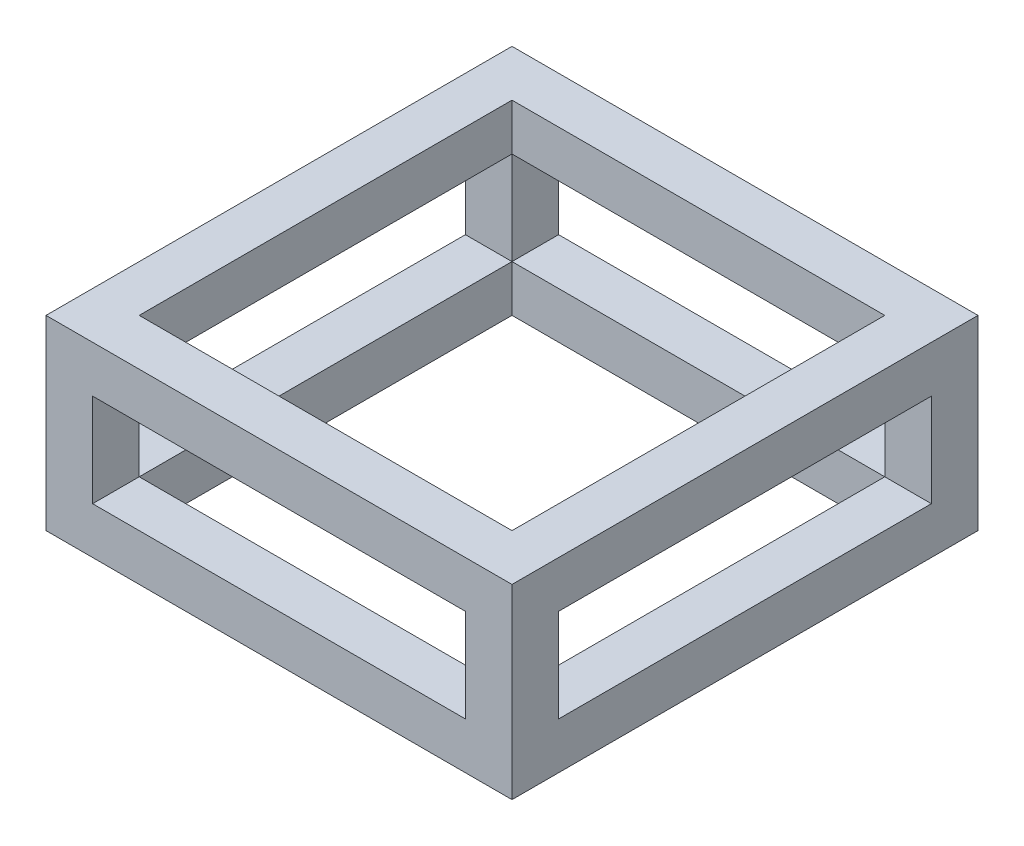
ISO-10303-21;
HEADER;
FILE_DESCRIPTION(('STEP AP214'),'2;1');
FILE_NAME('part.step','',(''),(''),'','','');
FILE_SCHEMA(('AUTOMOTIVE_DESIGN { 1 0 10303 214 1 1 1 1 }'));
ENDSEC;
DATA;
#1=APPLICATION_CONTEXT('core data for automotive mechanical design processes');
#2=APPLICATION_PROTOCOL_DEFINITION('international standard','automotive_design',2000,#1);
#3=PRODUCT_CONTEXT('',#1,'mechanical');
#4=PRODUCT('Part','Part','',(#3));
#5=PRODUCT_RELATED_PRODUCT_CATEGORY('part','',(#4));
#6=PRODUCT_DEFINITION_FORMATION('','',#4);
#7=PRODUCT_DEFINITION_CONTEXT('part definition',#1,'design');
#8=PRODUCT_DEFINITION('design','',#6,#7);
#9=PRODUCT_DEFINITION_SHAPE('','',#8);
#10=(LENGTH_UNIT() NAMED_UNIT(*) SI_UNIT(.MILLI.,.METRE.));
#11=(NAMED_UNIT(*) PLANE_ANGLE_UNIT() SI_UNIT($,.RADIAN.));
#12=(NAMED_UNIT(*) SI_UNIT($,.STERADIAN.) SOLID_ANGLE_UNIT());
#13=UNCERTAINTY_MEASURE_WITH_UNIT(LENGTH_MEASURE(1.E-05),#10,'distance_accuracy_value','');
#14=(GEOMETRIC_REPRESENTATION_CONTEXT(3) GLOBAL_UNCERTAINTY_ASSIGNED_CONTEXT((#13)) GLOBAL_UNIT_ASSIGNED_CONTEXT((#10,
#11,#12)) REPRESENTATION_CONTEXT('',''));
#15=CARTESIAN_POINT('',(0.,0.,0.));
#16=DIRECTION('',(0.,0.,1.));
#17=DIRECTION('',(1.,0.,0.));
#18=AXIS2_PLACEMENT_3D('',#15,#16,#17);
#19=CARTESIAN_POINT('',(0.,15.,0.));
#20=DIRECTION('',(0.,1.,0.));
#21=DIRECTION('',(0.,0.,1.));
#22=AXIS2_PLACEMENT_3D('',#19,#20,#21);
#23=PLANE('',#22);
#24=DIRECTION('',(1.,0.,0.));
#25=VECTOR('',#24,1.);
#26=CARTESIAN_POINT('',(-60.,15.,60.));
#27=LINE('',#26,#25);
#28=CARTESIAN_POINT('',(-60.,15.,60.));
#29=VERTEX_POINT('',#28);
#30=CARTESIAN_POINT('',(60.,15.,60.));
#31=VERTEX_POINT('',#30);
#32=EDGE_CURVE('E333',#29,#31,#27,.T.);
#33=ORIENTED_EDGE('',*,*,#32,.F.);
#34=DIRECTION('',(0.,0.,-1.));
#35=VECTOR('',#34,1.);
#36=CARTESIAN_POINT('',(-60.,15.,60.));
#37=LINE('',#36,#35);
#38=CARTESIAN_POINT('',(-60.,15.,75.));
#39=VERTEX_POINT('',#38);
#40=EDGE_CURVE('E231',#39,#29,#37,.T.);
#41=ORIENTED_EDGE('',*,*,#40,.F.);
#42=DIRECTION('',(1.,0.,0.));
#43=VECTOR('',#42,1.);
#44=CARTESIAN_POINT('',(-75.,15.,75.));
#45=LINE('',#44,#43);
#46=CARTESIAN_POINT('',(60.,15.,75.));
#47=VERTEX_POINT('',#46);
#48=EDGE_CURVE('E363',#39,#47,#45,.T.);
#49=ORIENTED_EDGE('',*,*,#48,.T.);
#50=DIRECTION('',(0.,0.,1.));
#51=VECTOR('',#50,1.);
#52=CARTESIAN_POINT('',(60.,15.,75.));
#53=LINE('',#52,#51);
#54=EDGE_CURVE('E265',#31,#47,#53,.T.);
#55=ORIENTED_EDGE('',*,*,#54,.F.);
#56=EDGE_LOOP('',(#33,#41,#49,#55));
#57=FACE_BOUND('',#56,.T.);
#58=ADVANCED_FACE('F33',(#57),#23,.T.);
#59=DIRECTION('',(0.,0.,1.));
#60=VECTOR('',#59,1.);
#61=CARTESIAN_POINT('',(-75.,15.,-75.));
#62=LINE('',#61,#60);
#63=CARTESIAN_POINT('',(-75.,15.,-60.));
#64=VERTEX_POINT('',#63);
#65=CARTESIAN_POINT('',(-75.,15.,60.));
#66=VERTEX_POINT('',#65);
#67=EDGE_CURVE('E48',#64,#66,#62,.T.);
#68=ORIENTED_EDGE('',*,*,#67,.T.);
#69=DIRECTION('',(-1.,0.,0.));
#70=VECTOR('',#69,1.);
#71=CARTESIAN_POINT('',(-60.,15.,60.));
#72=LINE('',#71,#70);
#73=EDGE_CURVE('E246',#29,#66,#72,.T.);
#74=ORIENTED_EDGE('',*,*,#73,.F.);
#75=DIRECTION('',(0.,0.,1.));
#76=VECTOR('',#75,1.);
#77=CARTESIAN_POINT('',(-60.,15.,-60.));
#78=LINE('',#77,#76);
#79=CARTESIAN_POINT('',(-60.,15.,-60.));
#80=VERTEX_POINT('',#79);
#81=EDGE_CURVE('E330',#80,#29,#78,.T.);
#82=ORIENTED_EDGE('',*,*,#81,.F.);
#83=DIRECTION('',(1.,0.,0.));
#84=VECTOR('',#83,1.);
#85=CARTESIAN_POINT('',(-75.,15.,-60.));
#86=LINE('',#85,#84);
#87=EDGE_CURVE('E301',#64,#80,#86,.T.);
#88=ORIENTED_EDGE('',*,*,#87,.F.);
#89=EDGE_LOOP('',(#68,#74,#82,#88));
#90=FACE_BOUND('',#89,.T.);
#91=ADVANCED_FACE('F437',(#90),#23,.T.);
#92=DIRECTION('',(0.,0.,-1.));
#93=VECTOR('',#92,1.);
#94=CARTESIAN_POINT('',(60.,15.,-60.));
#95=LINE('',#94,#93);
#96=CARTESIAN_POINT('',(60.,15.,-60.));
#97=VERTEX_POINT('',#96);
#98=EDGE_CURVE('E323',#31,#97,#95,.T.);
#99=ORIENTED_EDGE('',*,*,#98,.F.);
#100=DIRECTION('',(-1.,0.,0.));
#101=VECTOR('',#100,1.);
#102=CARTESIAN_POINT('',(75.,15.,60.));
#103=LINE('',#102,#101);
#104=CARTESIAN_POINT('',(75.,15.,60.));
#105=VERTEX_POINT('',#104);
#106=EDGE_CURVE('E56',#105,#31,#103,.T.);
#107=ORIENTED_EDGE('',*,*,#106,.F.);
#108=DIRECTION('',(0.,0.,-1.));
#109=VECTOR('',#108,1.);
#110=CARTESIAN_POINT('',(75.,15.,-75.));
#111=LINE('',#110,#109);
#112=CARTESIAN_POINT('',(75.,15.,-60.));
#113=VERTEX_POINT('',#112);
#114=EDGE_CURVE('E357',#105,#113,#111,.T.);
#115=ORIENTED_EDGE('',*,*,#114,.T.);
#116=DIRECTION('',(1.,0.,0.));
#117=VECTOR('',#116,1.);
#118=CARTESIAN_POINT('',(60.,15.,-60.));
#119=LINE('',#118,#117);
#120=EDGE_CURVE('E285',#97,#113,#119,.T.);
#121=ORIENTED_EDGE('',*,*,#120,.F.);
#122=EDGE_LOOP('',(#99,#107,#115,#121));
#123=FACE_BOUND('',#122,.T.);
#124=ADVANCED_FACE('F475',(#123),#23,.T.);
#125=DIRECTION('',(-1.,0.,0.));
#126=VECTOR('',#125,1.);
#127=CARTESIAN_POINT('',(-60.,15.,-60.));
#128=LINE('',#127,#126);
#129=EDGE_CURVE('E326',#97,#80,#128,.T.);
#130=ORIENTED_EDGE('',*,*,#129,.F.);
#131=DIRECTION('',(0.,0.,1.));
#132=VECTOR('',#131,1.);
#133=CARTESIAN_POINT('',(60.,15.,-60.));
#134=LINE('',#133,#132);
#135=CARTESIAN_POINT('',(60.,15.,-75.));
#136=VERTEX_POINT('',#135);
#137=EDGE_CURVE('E280',#136,#97,#134,.T.);
#138=ORIENTED_EDGE('',*,*,#137,.F.);
#139=DIRECTION('',(-1.,0.,0.));
#140=VECTOR('',#139,1.);
#141=CARTESIAN_POINT('',(-75.,15.,-75.));
#142=LINE('',#141,#140);
#143=CARTESIAN_POINT('',(-60.,15.,-75.));
#144=VERTEX_POINT('',#143);
#145=EDGE_CURVE('E359',#136,#144,#142,.T.);
#146=ORIENTED_EDGE('',*,*,#145,.T.);
#147=DIRECTION('',(0.,0.,-1.));
#148=VECTOR('',#147,1.);
#149=CARTESIAN_POINT('',(-60.,15.,-75.));
#150=LINE('',#149,#148);
#151=EDGE_CURVE('E306',#80,#144,#150,.T.);
#152=ORIENTED_EDGE('',*,*,#151,.F.);
#153=EDGE_LOOP('',(#130,#138,#146,#152));
#154=FACE_BOUND('',#153,.T.);
#155=ADVANCED_FACE('F449',(#154),#23,.T.);
#156=CARTESIAN_POINT('',(0.,0.,0.));
#157=DIRECTION('',(0.,1.,0.));
#158=DIRECTION('',(0.,0.,1.));
#159=AXIS2_PLACEMENT_3D('',#156,#157,#158);
#160=PLANE('',#159);
#161=DIRECTION('',(0.,0.,-1.));
#162=VECTOR('',#161,1.);
#163=CARTESIAN_POINT('',(75.,0.,-75.));
#164=LINE('',#163,#162);
#165=CARTESIAN_POINT('',(75.,0.,75.));
#166=VERTEX_POINT('',#165);
#167=CARTESIAN_POINT('',(75.,0.,-75.));
#168=VERTEX_POINT('',#167);
#169=EDGE_CURVE('E356',#166,#168,#164,.T.);
#170=ORIENTED_EDGE('',*,*,#169,.F.);
#171=DIRECTION('',(1.,0.,0.));
#172=VECTOR('',#171,1.);
#173=CARTESIAN_POINT('',(-75.,0.,75.));
#174=LINE('',#173,#172);
#175=CARTESIAN_POINT('',(-75.,0.,75.));
#176=VERTEX_POINT('',#175);
#177=EDGE_CURVE('E360',#176,#166,#174,.T.);
#178=ORIENTED_EDGE('',*,*,#177,.F.);
#179=DIRECTION('',(0.,0.,1.));
#180=VECTOR('',#179,1.);
#181=CARTESIAN_POINT('',(-75.,0.,-75.));
#182=LINE('',#181,#180);
#183=CARTESIAN_POINT('',(-75.,0.,-75.));
#184=VERTEX_POINT('',#183);
#185=EDGE_CURVE('E370',#184,#176,#182,.T.);
#186=ORIENTED_EDGE('',*,*,#185,.F.);
#187=DIRECTION('',(-1.,0.,0.));
#188=VECTOR('',#187,1.);
#189=CARTESIAN_POINT('',(-75.,0.,-75.));
#190=LINE('',#189,#188);
#191=EDGE_CURVE('E368',#168,#184,#190,.T.);
#192=ORIENTED_EDGE('',*,*,#191,.F.);
#193=EDGE_LOOP('',(#170,#178,#186,#192));
#194=FACE_BOUND('',#193,.T.);
#195=DIRECTION('',(0.,0.,-1.));
#196=VECTOR('',#195,1.);
#197=CARTESIAN_POINT('',(60.,0.,-60.));
#198=LINE('',#197,#196);
#199=CARTESIAN_POINT('',(60.,0.,60.));
#200=VERTEX_POINT('',#199);
#201=CARTESIAN_POINT('',(60.,0.,-60.));
#202=VERTEX_POINT('',#201);
#203=EDGE_CURVE('E322',#200,#202,#198,.T.);
#204=ORIENTED_EDGE('',*,*,#203,.T.);
#205=DIRECTION('',(-1.,0.,0.));
#206=VECTOR('',#205,1.);
#207=CARTESIAN_POINT('',(-60.,0.,-60.));
#208=LINE('',#207,#206);
#209=CARTESIAN_POINT('',(-60.,0.,-60.));
#210=VERTEX_POINT('',#209);
#211=EDGE_CURVE('E339',#202,#210,#208,.T.);
#212=ORIENTED_EDGE('',*,*,#211,.T.);
#213=DIRECTION('',(0.,0.,1.));
#214=VECTOR('',#213,1.);
#215=CARTESIAN_POINT('',(-60.,0.,-60.));
#216=LINE('',#215,#214);
#217=CARTESIAN_POINT('',(-60.,0.,60.));
#218=VERTEX_POINT('',#217);
#219=EDGE_CURVE('E342',#210,#218,#216,.T.);
#220=ORIENTED_EDGE('',*,*,#219,.T.);
#221=DIRECTION('',(1.,0.,0.));
#222=VECTOR('',#221,1.);
#223=CARTESIAN_POINT('',(-60.,0.,60.));
#224=LINE('',#223,#222);
#225=EDGE_CURVE('E327',#218,#200,#224,.T.);
#226=ORIENTED_EDGE('',*,*,#225,.T.);
#227=EDGE_LOOP('',(#204,#212,#220,#226));
#228=FACE_BOUND('',#227,.T.);
#229=ADVANCED_FACE('F387',(#194,#228),#160,.F.);
#230=CARTESIAN_POINT('',(75.,15.,-75.));
#231=DIRECTION('',(-1.,0.,0.));
#232=DIRECTION('',(0.,0.,1.));
#233=AXIS2_PLACEMENT_3D('',#230,#231,#232);
#234=PLANE('',#233);
#235=DIRECTION('',(0.,-1.,0.));
#236=VECTOR('',#235,1.);
#237=CARTESIAN_POINT('',(75.,15.,-75.));
#238=LINE('',#237,#236);
#239=CARTESIAN_POINT('',(75.,60.,-75.));
#240=VERTEX_POINT('',#239);
#241=EDGE_CURVE('E11',#240,#168,#238,.T.);
#242=ORIENTED_EDGE('',*,*,#241,.F.);
#243=DIRECTION('',(0.,0.,-1.));
#244=VECTOR('',#243,1.);
#245=CARTESIAN_POINT('',(75.,60.,-75.));
#246=LINE('',#245,#244);
#247=CARTESIAN_POINT('',(75.,60.,75.));
#248=VERTEX_POINT('',#247);
#249=EDGE_CURVE('E225',#248,#240,#246,.T.);
#250=ORIENTED_EDGE('',*,*,#249,.F.);
#251=DIRECTION('',(0.,-1.,0.));
#252=VECTOR('',#251,1.);
#253=CARTESIAN_POINT('',(75.,15.,75.));
#254=LINE('',#253,#252);
#255=EDGE_CURVE('E365',#248,#166,#254,.T.);
#256=ORIENTED_EDGE('',*,*,#255,.T.);
#257=ORIENTED_EDGE('',*,*,#169,.T.);
#258=EDGE_LOOP('',(#242,#250,#256,#257));
#259=FACE_BOUND('',#258,.T.);
#260=DIRECTION('',(0.,0.,-1.));
#261=VECTOR('',#260,1.);
#262=CARTESIAN_POINT('',(75.,45.,-75.));
#263=LINE('',#262,#261);
#264=CARTESIAN_POINT('',(75.,45.,60.));
#265=VERTEX_POINT('',#264);
#266=CARTESIAN_POINT('',(75.,45.,-60.));
#267=VERTEX_POINT('',#266);
#268=EDGE_CURVE('E237',#265,#267,#263,.T.);
#269=ORIENTED_EDGE('',*,*,#268,.T.);
#270=DIRECTION('',(0.,-1.,0.));
#271=VECTOR('',#270,1.);
#272=CARTESIAN_POINT('',(75.,45.,-60.));
#273=LINE('',#272,#271);
#274=EDGE_CURVE('E295',#267,#113,#273,.T.);
#275=ORIENTED_EDGE('',*,*,#274,.T.);
#276=ORIENTED_EDGE('',*,*,#114,.F.);
#277=DIRECTION('',(0.,-1.,0.));
#278=VECTOR('',#277,1.);
#279=CARTESIAN_POINT('',(75.,45.,60.));
#280=LINE('',#279,#278);
#281=EDGE_CURVE('E277',#265,#105,#280,.T.);
#282=ORIENTED_EDGE('',*,*,#281,.F.);
#283=EDGE_LOOP('',(#269,#275,#276,#282));
#284=FACE_BOUND('',#283,.T.);
#285=ADVANCED_FACE('F35',(#259,#284),#234,.F.);
#286=CARTESIAN_POINT('',(-75.,15.,-75.));
#287=DIRECTION('',(0.,0.,1.));
#288=DIRECTION('',(1.,0.,0.));
#289=AXIS2_PLACEMENT_3D('',#286,#287,#288);
#290=PLANE('',#289);
#291=DIRECTION('',(0.,-1.,0.));
#292=VECTOR('',#291,1.);
#293=CARTESIAN_POINT('',(-75.,15.,-75.));
#294=LINE('',#293,#292);
#295=CARTESIAN_POINT('',(-75.,60.,-75.));
#296=VERTEX_POINT('',#295);
#297=EDGE_CURVE('E41',#296,#184,#294,.T.);
#298=ORIENTED_EDGE('',*,*,#297,.F.);
#299=DIRECTION('',(-1.,0.,0.));
#300=VECTOR('',#299,1.);
#301=CARTESIAN_POINT('',(-75.,60.,-75.));
#302=LINE('',#301,#300);
#303=EDGE_CURVE('E228',#240,#296,#302,.T.);
#304=ORIENTED_EDGE('',*,*,#303,.F.);
#305=ORIENTED_EDGE('',*,*,#241,.T.);
#306=ORIENTED_EDGE('',*,*,#191,.T.);
#307=EDGE_LOOP('',(#298,#304,#305,#306));
#308=FACE_BOUND('',#307,.T.);
#309=DIRECTION('',(-1.,0.,0.));
#310=VECTOR('',#309,1.);
#311=CARTESIAN_POINT('',(-75.,45.,-75.));
#312=LINE('',#311,#310);
#313=CARTESIAN_POINT('',(60.,45.,-75.));
#314=VERTEX_POINT('',#313);
#315=CARTESIAN_POINT('',(-60.,45.,-75.));
#316=VERTEX_POINT('',#315);
#317=EDGE_CURVE('E222',#314,#316,#312,.T.);
#318=ORIENTED_EDGE('',*,*,#317,.T.);
#319=DIRECTION('',(0.,-1.,0.));
#320=VECTOR('',#319,1.);
#321=CARTESIAN_POINT('',(-60.,45.,-75.));
#322=LINE('',#321,#320);
#323=EDGE_CURVE('E309',#316,#144,#322,.T.);
#324=ORIENTED_EDGE('',*,*,#323,.T.);
#325=ORIENTED_EDGE('',*,*,#145,.F.);
#326=DIRECTION('',(0.,-1.,0.));
#327=VECTOR('',#326,1.);
#328=CARTESIAN_POINT('',(60.,45.,-75.));
#329=LINE('',#328,#327);
#330=EDGE_CURVE('E288',#314,#136,#329,.T.);
#331=ORIENTED_EDGE('',*,*,#330,.F.);
#332=EDGE_LOOP('',(#318,#324,#325,#331));
#333=FACE_BOUND('',#332,.T.);
#334=ADVANCED_FACE('F397',(#308,#333),#290,.F.);
#335=CARTESIAN_POINT('',(-75.,15.,-75.));
#336=DIRECTION('',(1.,0.,0.));
#337=DIRECTION('',(0.,0.,-1.));
#338=AXIS2_PLACEMENT_3D('',#335,#336,#337);
#339=PLANE('',#338);
#340=DIRECTION('',(0.,-1.,0.));
#341=VECTOR('',#340,1.);
#342=CARTESIAN_POINT('',(-75.,45.,-60.));
#343=LINE('',#342,#341);
#344=CARTESIAN_POINT('',(-75.,45.,-60.));
#345=VERTEX_POINT('',#344);
#346=EDGE_CURVE('E319',#345,#64,#343,.T.);
#347=ORIENTED_EDGE('',*,*,#346,.F.);
#348=DIRECTION('',(0.,0.,1.));
#349=VECTOR('',#348,1.);
#350=CARTESIAN_POINT('',(-75.,45.,-75.));
#351=LINE('',#350,#349);
#352=CARTESIAN_POINT('',(-75.,45.,60.));
#353=VERTEX_POINT('',#352);
#354=EDGE_CURVE('E193',#345,#353,#351,.T.);
#355=ORIENTED_EDGE('',*,*,#354,.T.);
#356=DIRECTION('',(0.,-1.,0.));
#357=VECTOR('',#356,1.);
#358=CARTESIAN_POINT('',(-75.,45.,60.));
#359=LINE('',#358,#357);
#360=EDGE_CURVE('E255',#353,#66,#359,.T.);
#361=ORIENTED_EDGE('',*,*,#360,.T.);
#362=ORIENTED_EDGE('',*,*,#67,.F.);
#363=EDGE_LOOP('',(#347,#355,#361,#362));
#364=FACE_BOUND('',#363,.T.);
#365=ORIENTED_EDGE('',*,*,#185,.T.);
#366=DIRECTION('',(0.,-1.,0.));
#367=VECTOR('',#366,1.);
#368=CARTESIAN_POINT('',(-75.,15.,75.));
#369=LINE('',#368,#367);
#370=CARTESIAN_POINT('',(-75.,60.,75.));
#371=VERTEX_POINT('',#370);
#372=EDGE_CURVE('E375',#371,#176,#369,.T.);
#373=ORIENTED_EDGE('',*,*,#372,.F.);
#374=DIRECTION('',(0.,0.,1.));
#375=VECTOR('',#374,1.);
#376=CARTESIAN_POINT('',(-75.,60.,-75.));
#377=LINE('',#376,#375);
#378=EDGE_CURVE('E218',#296,#371,#377,.T.);
#379=ORIENTED_EDGE('',*,*,#378,.F.);
#380=ORIENTED_EDGE('',*,*,#297,.T.);
#381=EDGE_LOOP('',(#365,#373,#379,#380));
#382=FACE_BOUND('',#381,.T.);
#383=ADVANCED_FACE('F381',(#364,#382),#339,.F.);
#384=CARTESIAN_POINT('',(-75.,15.,75.));
#385=DIRECTION('',(0.,0.,-1.));
#386=DIRECTION('',(-1.,0.,0.));
#387=AXIS2_PLACEMENT_3D('',#384,#385,#386);
#388=PLANE('',#387);
#389=ORIENTED_EDGE('',*,*,#255,.F.);
#390=DIRECTION('',(1.,0.,0.));
#391=VECTOR('',#390,1.);
#392=CARTESIAN_POINT('',(-75.,60.,75.));
#393=LINE('',#392,#391);
#394=EDGE_CURVE('E221',#371,#248,#393,.T.);
#395=ORIENTED_EDGE('',*,*,#394,.F.);
#396=ORIENTED_EDGE('',*,*,#372,.T.);
#397=ORIENTED_EDGE('',*,*,#177,.T.);
#398=EDGE_LOOP('',(#389,#395,#396,#397));
#399=FACE_BOUND('',#398,.T.);
#400=DIRECTION('',(1.,0.,0.));
#401=VECTOR('',#400,1.);
#402=CARTESIAN_POINT('',(-75.,45.,75.));
#403=LINE('',#402,#401);
#404=CARTESIAN_POINT('',(-60.,45.,75.));
#405=VERTEX_POINT('',#404);
#406=CARTESIAN_POINT('',(60.,45.,75.));
#407=VERTEX_POINT('',#406);
#408=EDGE_CURVE('E234',#405,#407,#403,.T.);
#409=ORIENTED_EDGE('',*,*,#408,.T.);
#410=DIRECTION('',(0.,-1.,0.));
#411=VECTOR('',#410,1.);
#412=CARTESIAN_POINT('',(60.,45.,75.));
#413=LINE('',#412,#411);
#414=EDGE_CURVE('E268',#407,#47,#413,.T.);
#415=ORIENTED_EDGE('',*,*,#414,.T.);
#416=ORIENTED_EDGE('',*,*,#48,.F.);
#417=DIRECTION('',(0.,-1.,0.));
#418=VECTOR('',#417,1.);
#419=CARTESIAN_POINT('',(-60.,45.,75.));
#420=LINE('',#419,#418);
#421=EDGE_CURVE('E249',#405,#39,#420,.T.);
#422=ORIENTED_EDGE('',*,*,#421,.F.);
#423=EDGE_LOOP('',(#409,#415,#416,#422));
#424=FACE_BOUND('',#423,.T.);
#425=ADVANCED_FACE('F390',(#399,#424),#388,.F.);
#426=CARTESIAN_POINT('',(60.,15.,-60.));
#427=DIRECTION('',(-1.,0.,0.));
#428=DIRECTION('',(0.,0.,1.));
#429=AXIS2_PLACEMENT_3D('',#426,#427,#428);
#430=PLANE('',#429);
#431=ORIENTED_EDGE('',*,*,#203,.F.);
#432=DIRECTION('',(0.,-1.,0.));
#433=VECTOR('',#432,1.);
#434=CARTESIAN_POINT('',(60.,15.,60.));
#435=LINE('',#434,#433);
#436=EDGE_CURVE('E336',#31,#200,#435,.T.);
#437=ORIENTED_EDGE('',*,*,#436,.F.);
#438=ORIENTED_EDGE('',*,*,#98,.T.);
#439=DIRECTION('',(0.,-1.,0.));
#440=VECTOR('',#439,1.);
#441=CARTESIAN_POINT('',(60.,15.,-60.));
#442=LINE('',#441,#440);
#443=EDGE_CURVE('E353',#97,#202,#442,.T.);
#444=ORIENTED_EDGE('',*,*,#443,.T.);
#445=EDGE_LOOP('',(#431,#437,#438,#444));
#446=FACE_BOUND('',#445,.T.);
#447=ADVANCED_FACE('F486',(#446),#430,.T.);
#448=CARTESIAN_POINT('',(-60.,15.,-60.));
#449=DIRECTION('',(0.,0.,1.));
#450=DIRECTION('',(1.,0.,0.));
#451=AXIS2_PLACEMENT_3D('',#448,#449,#450);
#452=PLANE('',#451);
#453=ORIENTED_EDGE('',*,*,#211,.F.);
#454=ORIENTED_EDGE('',*,*,#443,.F.);
#455=ORIENTED_EDGE('',*,*,#129,.T.);
#456=DIRECTION('',(0.,-1.,0.));
#457=VECTOR('',#456,1.);
#458=CARTESIAN_POINT('',(-60.,15.,-60.));
#459=LINE('',#458,#457);
#460=EDGE_CURVE('E351',#80,#210,#459,.T.);
#461=ORIENTED_EDGE('',*,*,#460,.T.);
#462=EDGE_LOOP('',(#453,#454,#455,#461));
#463=FACE_BOUND('',#462,.T.);
#464=ADVANCED_FACE('F446',(#463),#452,.T.);
#465=CARTESIAN_POINT('',(-60.,15.,-60.));
#466=DIRECTION('',(1.,0.,0.));
#467=DIRECTION('',(0.,0.,-1.));
#468=AXIS2_PLACEMENT_3D('',#465,#466,#467);
#469=PLANE('',#468);
#470=ORIENTED_EDGE('',*,*,#219,.F.);
#471=ORIENTED_EDGE('',*,*,#460,.F.);
#472=ORIENTED_EDGE('',*,*,#81,.T.);
#473=DIRECTION('',(0.,-1.,0.));
#474=VECTOR('',#473,1.);
#475=CARTESIAN_POINT('',(-60.,15.,60.));
#476=LINE('',#475,#474);
#477=EDGE_CURVE('E349',#29,#218,#476,.T.);
#478=ORIENTED_EDGE('',*,*,#477,.T.);
#479=EDGE_LOOP('',(#470,#471,#472,#478));
#480=FACE_BOUND('',#479,.T.);
#481=ADVANCED_FACE('F441',(#480),#469,.T.);
#482=CARTESIAN_POINT('',(-60.,15.,60.));
#483=DIRECTION('',(0.,0.,-1.));
#484=DIRECTION('',(-1.,0.,0.));
#485=AXIS2_PLACEMENT_3D('',#482,#483,#484);
#486=PLANE('',#485);
#487=ORIENTED_EDGE('',*,*,#225,.F.);
#488=ORIENTED_EDGE('',*,*,#477,.F.);
#489=ORIENTED_EDGE('',*,*,#32,.T.);
#490=ORIENTED_EDGE('',*,*,#436,.T.);
#491=EDGE_LOOP('',(#487,#488,#489,#490));
#492=FACE_BOUND('',#491,.T.);
#493=ADVANCED_FACE('F488',(#492),#486,.T.);
#494=CARTESIAN_POINT('',(-75.,45.,-60.));
#495=DIRECTION('',(0.,0.,-1.));
#496=DIRECTION('',(-1.,0.,0.));
#497=AXIS2_PLACEMENT_3D('',#494,#495,#496);
#498=PLANE('',#497);
#499=ORIENTED_EDGE('',*,*,#87,.T.);
#500=DIRECTION('',(0.,-1.,0.));
#501=VECTOR('',#500,1.);
#502=CARTESIAN_POINT('',(-60.,45.,-60.));
#503=LINE('',#502,#501);
#504=CARTESIAN_POINT('',(-60.,45.,-60.));
#505=VERTEX_POINT('',#504);
#506=EDGE_CURVE('E316',#505,#80,#503,.T.);
#507=ORIENTED_EDGE('',*,*,#506,.F.);
#508=DIRECTION('',(1.,0.,0.));
#509=VECTOR('',#508,1.);
#510=CARTESIAN_POINT('',(-75.,45.,-60.));
#511=LINE('',#510,#509);
#512=EDGE_CURVE('E302',#345,#505,#511,.T.);
#513=ORIENTED_EDGE('',*,*,#512,.F.);
#514=ORIENTED_EDGE('',*,*,#346,.T.);
#515=EDGE_LOOP('',(#499,#507,#513,#514));
#516=FACE_BOUND('',#515,.T.);
#517=ADVANCED_FACE('F436',(#516),#498,.F.);
#518=CARTESIAN_POINT('',(-60.,45.,-75.));
#519=DIRECTION('',(-1.,0.,0.));
#520=DIRECTION('',(0.,0.,1.));
#521=AXIS2_PLACEMENT_3D('',#518,#519,#520);
#522=PLANE('',#521);
#523=ORIENTED_EDGE('',*,*,#151,.T.);
#524=ORIENTED_EDGE('',*,*,#323,.F.);
#525=DIRECTION('',(0.,0.,-1.));
#526=VECTOR('',#525,1.);
#527=CARTESIAN_POINT('',(-60.,45.,-75.));
#528=LINE('',#527,#526);
#529=EDGE_CURVE('E305',#505,#316,#528,.T.);
#530=ORIENTED_EDGE('',*,*,#529,.F.);
#531=ORIENTED_EDGE('',*,*,#506,.T.);
#532=EDGE_LOOP('',(#523,#524,#530,#531));
#533=FACE_BOUND('',#532,.T.);
#534=ADVANCED_FACE('F407',(#533),#522,.F.);
#535=CARTESIAN_POINT('',(60.,45.,-60.));
#536=DIRECTION('',(1.,0.,0.));
#537=DIRECTION('',(0.,0.,-1.));
#538=AXIS2_PLACEMENT_3D('',#535,#536,#537);
#539=PLANE('',#538);
#540=ORIENTED_EDGE('',*,*,#137,.T.);
#541=DIRECTION('',(0.,-1.,0.));
#542=VECTOR('',#541,1.);
#543=CARTESIAN_POINT('',(60.,45.,-60.));
#544=LINE('',#543,#542);
#545=CARTESIAN_POINT('',(60.,45.,-60.));
#546=VERTEX_POINT('',#545);
#547=EDGE_CURVE('E298',#546,#97,#544,.T.);
#548=ORIENTED_EDGE('',*,*,#547,.F.);
#549=DIRECTION('',(0.,0.,1.));
#550=VECTOR('',#549,1.);
#551=CARTESIAN_POINT('',(60.,45.,-60.));
#552=LINE('',#551,#550);
#553=EDGE_CURVE('E281',#314,#546,#552,.T.);
#554=ORIENTED_EDGE('',*,*,#553,.F.);
#555=ORIENTED_EDGE('',*,*,#330,.T.);
#556=EDGE_LOOP('',(#540,#548,#554,#555));
#557=FACE_BOUND('',#556,.T.);
#558=ADVANCED_FACE('F452',(#557),#539,.F.);
#559=CARTESIAN_POINT('',(60.,45.,-60.));
#560=DIRECTION('',(0.,0.,-1.));
#561=DIRECTION('',(-1.,0.,0.));
#562=AXIS2_PLACEMENT_3D('',#559,#560,#561);
#563=PLANE('',#562);
#564=ORIENTED_EDGE('',*,*,#120,.T.);
#565=ORIENTED_EDGE('',*,*,#274,.F.);
#566=DIRECTION('',(1.,0.,0.));
#567=VECTOR('',#566,1.);
#568=CARTESIAN_POINT('',(60.,45.,-60.));
#569=LINE('',#568,#567);
#570=EDGE_CURVE('E284',#546,#267,#569,.T.);
#571=ORIENTED_EDGE('',*,*,#570,.F.);
#572=ORIENTED_EDGE('',*,*,#547,.T.);
#573=EDGE_LOOP('',(#564,#565,#571,#572));
#574=FACE_BOUND('',#573,.T.);
#575=ADVANCED_FACE('F454',(#574),#563,.F.);
#576=CARTESIAN_POINT('',(75.,45.,60.));
#577=DIRECTION('',(0.,0.,1.));
#578=DIRECTION('',(1.,0.,0.));
#579=AXIS2_PLACEMENT_3D('',#576,#577,#578);
#580=PLANE('',#579);
#581=ORIENTED_EDGE('',*,*,#106,.T.);
#582=DIRECTION('',(0.,-1.,0.));
#583=VECTOR('',#582,1.);
#584=CARTESIAN_POINT('',(60.,45.,60.));
#585=LINE('',#584,#583);
#586=CARTESIAN_POINT('',(60.,45.,60.));
#587=VERTEX_POINT('',#586);
#588=EDGE_CURVE('E274',#587,#31,#585,.T.);
#589=ORIENTED_EDGE('',*,*,#588,.F.);
#590=DIRECTION('',(-1.,0.,0.));
#591=VECTOR('',#590,1.);
#592=CARTESIAN_POINT('',(75.,45.,60.));
#593=LINE('',#592,#591);
#594=EDGE_CURVE('E261',#265,#587,#593,.T.);
#595=ORIENTED_EDGE('',*,*,#594,.F.);
#596=ORIENTED_EDGE('',*,*,#281,.T.);
#597=EDGE_LOOP('',(#581,#589,#595,#596));
#598=FACE_BOUND('',#597,.T.);
#599=ADVANCED_FACE('F459',(#598),#580,.F.);
#600=CARTESIAN_POINT('',(60.,45.,75.));
#601=DIRECTION('',(1.,0.,0.));
#602=DIRECTION('',(0.,0.,-1.));
#603=AXIS2_PLACEMENT_3D('',#600,#601,#602);
#604=PLANE('',#603);
#605=ORIENTED_EDGE('',*,*,#54,.T.);
#606=ORIENTED_EDGE('',*,*,#414,.F.);
#607=DIRECTION('',(0.,0.,1.));
#608=VECTOR('',#607,1.);
#609=CARTESIAN_POINT('',(60.,45.,75.));
#610=LINE('',#609,#608);
#611=EDGE_CURVE('E264',#587,#407,#610,.T.);
#612=ORIENTED_EDGE('',*,*,#611,.F.);
#613=ORIENTED_EDGE('',*,*,#588,.T.);
#614=EDGE_LOOP('',(#605,#606,#612,#613));
#615=FACE_BOUND('',#614,.T.);
#616=ADVANCED_FACE('F461',(#615),#604,.F.);
#617=CARTESIAN_POINT('',(-60.,45.,60.));
#618=DIRECTION('',(-1.,0.,0.));
#619=DIRECTION('',(0.,0.,1.));
#620=AXIS2_PLACEMENT_3D('',#617,#618,#619);
#621=PLANE('',#620);
#622=ORIENTED_EDGE('',*,*,#40,.T.);
#623=DIRECTION('',(0.,-1.,0.));
#624=VECTOR('',#623,1.);
#625=CARTESIAN_POINT('',(-60.,45.,60.));
#626=LINE('',#625,#624);
#627=CARTESIAN_POINT('',(-60.,45.,60.));
#628=VERTEX_POINT('',#627);
#629=EDGE_CURVE('E258',#628,#29,#626,.T.);
#630=ORIENTED_EDGE('',*,*,#629,.F.);
#631=DIRECTION('',(0.,0.,-1.));
#632=VECTOR('',#631,1.);
#633=CARTESIAN_POINT('',(-60.,45.,60.));
#634=LINE('',#633,#632);
#635=EDGE_CURVE('E242',#405,#628,#634,.T.);
#636=ORIENTED_EDGE('',*,*,#635,.F.);
#637=ORIENTED_EDGE('',*,*,#421,.T.);
#638=EDGE_LOOP('',(#622,#630,#636,#637));
#639=FACE_BOUND('',#638,.T.);
#640=ADVANCED_FACE('F426',(#639),#621,.F.);
#641=CARTESIAN_POINT('',(-60.,45.,60.));
#642=DIRECTION('',(0.,0.,1.));
#643=DIRECTION('',(1.,0.,0.));
#644=AXIS2_PLACEMENT_3D('',#641,#642,#643);
#645=PLANE('',#644);
#646=ORIENTED_EDGE('',*,*,#73,.T.);
#647=ORIENTED_EDGE('',*,*,#360,.F.);
#648=DIRECTION('',(-1.,0.,0.));
#649=VECTOR('',#648,1.);
#650=CARTESIAN_POINT('',(-60.,45.,60.));
#651=LINE('',#650,#649);
#652=EDGE_CURVE('E245',#628,#353,#651,.T.);
#653=ORIENTED_EDGE('',*,*,#652,.F.);
#654=ORIENTED_EDGE('',*,*,#629,.T.);
#655=EDGE_LOOP('',(#646,#647,#653,#654));
#656=FACE_BOUND('',#655,.T.);
#657=ADVANCED_FACE('F434',(#656),#645,.F.);
#658=CARTESIAN_POINT('',(0.,45.,0.));
#659=DIRECTION('',(0.,1.,0.));
#660=DIRECTION('',(0.,0.,1.));
#661=AXIS2_PLACEMENT_3D('',#658,#659,#660);
#662=PLANE('',#661);
#663=ORIENTED_EDGE('',*,*,#354,.F.);
#664=ORIENTED_EDGE('',*,*,#512,.T.);
#665=DIRECTION('',(0.,0.,1.));
#666=VECTOR('',#665,1.);
#667=CARTESIAN_POINT('',(-60.,45.,-60.));
#668=LINE('',#667,#666);
#669=EDGE_CURVE('E205',#505,#628,#668,.T.);
#670=ORIENTED_EDGE('',*,*,#669,.T.);
#671=ORIENTED_EDGE('',*,*,#652,.T.);
#672=EDGE_LOOP('',(#663,#664,#670,#671));
#673=FACE_BOUND('',#672,.T.);
#674=ADVANCED_FACE('F410',(#673),#662,.F.);
#675=DIRECTION('',(-1.,0.,0.));
#676=VECTOR('',#675,1.);
#677=CARTESIAN_POINT('',(-60.,45.,-60.));
#678=LINE('',#677,#676);
#679=EDGE_CURVE('E184',#546,#505,#678,.T.);
#680=ORIENTED_EDGE('',*,*,#679,.T.);
#681=ORIENTED_EDGE('',*,*,#529,.T.);
#682=ORIENTED_EDGE('',*,*,#317,.F.);
#683=ORIENTED_EDGE('',*,*,#553,.T.);
#684=EDGE_LOOP('',(#680,#681,#682,#683));
#685=FACE_BOUND('',#684,.T.);
#686=ADVANCED_FACE('F403',(#685),#662,.F.);
#687=DIRECTION('',(0.,0.,-1.));
#688=VECTOR('',#687,1.);
#689=CARTESIAN_POINT('',(60.,45.,-60.));
#690=LINE('',#689,#688);
#691=EDGE_CURVE('E208',#587,#546,#690,.T.);
#692=ORIENTED_EDGE('',*,*,#691,.T.);
#693=ORIENTED_EDGE('',*,*,#570,.T.);
#694=ORIENTED_EDGE('',*,*,#268,.F.);
#695=ORIENTED_EDGE('',*,*,#594,.T.);
#696=EDGE_LOOP('',(#692,#693,#694,#695));
#697=FACE_BOUND('',#696,.T.);
#698=ADVANCED_FACE('F456',(#697),#662,.F.);
#699=DIRECTION('',(1.,0.,0.));
#700=VECTOR('',#699,1.);
#701=CARTESIAN_POINT('',(-60.,45.,60.));
#702=LINE('',#701,#700);
#703=EDGE_CURVE('E192',#628,#587,#702,.T.);
#704=ORIENTED_EDGE('',*,*,#703,.T.);
#705=ORIENTED_EDGE('',*,*,#611,.T.);
#706=ORIENTED_EDGE('',*,*,#408,.F.);
#707=ORIENTED_EDGE('',*,*,#635,.T.);
#708=EDGE_LOOP('',(#704,#705,#706,#707));
#709=FACE_BOUND('',#708,.T.);
#710=ADVANCED_FACE('F420',(#709),#662,.F.);
#711=CARTESIAN_POINT('',(0.,60.,0.));
#712=DIRECTION('',(0.,1.,0.));
#713=DIRECTION('',(0.,0.,1.));
#714=AXIS2_PLACEMENT_3D('',#711,#712,#713);
#715=PLANE('',#714);
#716=ORIENTED_EDGE('',*,*,#378,.T.);
#717=ORIENTED_EDGE('',*,*,#394,.T.);
#718=ORIENTED_EDGE('',*,*,#249,.T.);
#719=ORIENTED_EDGE('',*,*,#303,.T.);
#720=EDGE_LOOP('',(#716,#717,#718,#719));
#721=FACE_BOUND('',#720,.T.);
#722=DIRECTION('',(1.,0.,0.));
#723=VECTOR('',#722,1.);
#724=CARTESIAN_POINT('',(-60.,60.,60.));
#725=LINE('',#724,#723);
#726=CARTESIAN_POINT('',(-60.,60.,60.));
#727=VERTEX_POINT('',#726);
#728=CARTESIAN_POINT('',(60.,60.,60.));
#729=VERTEX_POINT('',#728);
#730=EDGE_CURVE('E183',#727,#729,#725,.T.);
#731=ORIENTED_EDGE('',*,*,#730,.F.);
#732=DIRECTION('',(0.,0.,1.));
#733=VECTOR('',#732,1.);
#734=CARTESIAN_POINT('',(-60.,60.,-60.));
#735=LINE('',#734,#733);
#736=CARTESIAN_POINT('',(-60.,60.,-60.));
#737=VERTEX_POINT('',#736);
#738=EDGE_CURVE('E172',#737,#727,#735,.T.);
#739=ORIENTED_EDGE('',*,*,#738,.F.);
#740=DIRECTION('',(-1.,0.,0.));
#741=VECTOR('',#740,1.);
#742=CARTESIAN_POINT('',(-60.,60.,-60.));
#743=LINE('',#742,#741);
#744=CARTESIAN_POINT('',(60.,60.,-60.));
#745=VERTEX_POINT('',#744);
#746=EDGE_CURVE('E201',#745,#737,#743,.T.);
#747=ORIENTED_EDGE('',*,*,#746,.F.);
#748=DIRECTION('',(0.,0.,-1.));
#749=VECTOR('',#748,1.);
#750=CARTESIAN_POINT('',(60.,60.,-60.));
#751=LINE('',#750,#749);
#752=EDGE_CURVE('E199',#729,#745,#751,.T.);
#753=ORIENTED_EDGE('',*,*,#752,.F.);
#754=EDGE_LOOP('',(#731,#739,#747,#753));
#755=FACE_BOUND('',#754,.T.);
#756=ADVANCED_FACE('F197',(#721,#755),#715,.T.);
#757=CARTESIAN_POINT('',(-60.,60.,-60.));
#758=DIRECTION('',(1.,0.,0.));
#759=DIRECTION('',(0.,0.,-1.));
#760=AXIS2_PLACEMENT_3D('',#757,#758,#759);
#761=PLANE('',#760);
#762=ORIENTED_EDGE('',*,*,#669,.F.);
#763=DIRECTION('',(0.,-1.,0.));
#764=VECTOR('',#763,1.);
#765=CARTESIAN_POINT('',(-60.,60.,-60.));
#766=LINE('',#765,#764);
#767=EDGE_CURVE('E179',#737,#505,#766,.T.);
#768=ORIENTED_EDGE('',*,*,#767,.F.);
#769=ORIENTED_EDGE('',*,*,#738,.T.);
#770=DIRECTION('',(0.,-1.,0.));
#771=VECTOR('',#770,1.);
#772=CARTESIAN_POINT('',(-60.,60.,60.));
#773=LINE('',#772,#771);
#774=EDGE_CURVE('E176',#727,#628,#773,.T.);
#775=ORIENTED_EDGE('',*,*,#774,.T.);
#776=EDGE_LOOP('',(#762,#768,#769,#775));
#777=FACE_BOUND('',#776,.T.);
#778=ADVANCED_FACE('F175',(#777),#761,.T.);
#779=CARTESIAN_POINT('',(-60.,60.,60.));
#780=DIRECTION('',(0.,0.,-1.));
#781=DIRECTION('',(-1.,0.,0.));
#782=AXIS2_PLACEMENT_3D('',#779,#780,#781);
#783=PLANE('',#782);
#784=ORIENTED_EDGE('',*,*,#703,.F.);
#785=ORIENTED_EDGE('',*,*,#774,.F.);
#786=ORIENTED_EDGE('',*,*,#730,.T.);
#787=DIRECTION('',(0.,-1.,0.));
#788=VECTOR('',#787,1.);
#789=CARTESIAN_POINT('',(60.,60.,60.));
#790=LINE('',#789,#788);
#791=EDGE_CURVE('E194',#729,#587,#790,.T.);
#792=ORIENTED_EDGE('',*,*,#791,.T.);
#793=EDGE_LOOP('',(#784,#785,#786,#792));
#794=FACE_BOUND('',#793,.T.);
#795=ADVANCED_FACE('F188',(#794),#783,.T.);
#796=CARTESIAN_POINT('',(60.,60.,-60.));
#797=DIRECTION('',(-1.,0.,0.));
#798=DIRECTION('',(0.,0.,1.));
#799=AXIS2_PLACEMENT_3D('',#796,#797,#798);
#800=PLANE('',#799);
#801=ORIENTED_EDGE('',*,*,#691,.F.);
#802=ORIENTED_EDGE('',*,*,#791,.F.);
#803=ORIENTED_EDGE('',*,*,#752,.T.);
#804=DIRECTION('',(0.,-1.,0.));
#805=VECTOR('',#804,1.);
#806=CARTESIAN_POINT('',(60.,60.,-60.));
#807=LINE('',#806,#805);
#808=EDGE_CURVE('E214',#745,#546,#807,.T.);
#809=ORIENTED_EDGE('',*,*,#808,.T.);
#810=EDGE_LOOP('',(#801,#802,#803,#809));
#811=FACE_BOUND('',#810,.T.);
#812=ADVANCED_FACE('F417',(#811),#800,.T.);
#813=CARTESIAN_POINT('',(-60.,60.,-60.));
#814=DIRECTION('',(0.,0.,1.));
#815=DIRECTION('',(1.,0.,0.));
#816=AXIS2_PLACEMENT_3D('',#813,#814,#815);
#817=PLANE('',#816);
#818=ORIENTED_EDGE('',*,*,#679,.F.);
#819=ORIENTED_EDGE('',*,*,#808,.F.);
#820=ORIENTED_EDGE('',*,*,#746,.T.);
#821=ORIENTED_EDGE('',*,*,#767,.T.);
#822=EDGE_LOOP('',(#818,#819,#820,#821));
#823=FACE_BOUND('',#822,.T.);
#824=ADVANCED_FACE('F414',(#823),#817,.T.);
#825=CLOSED_SHELL('',(#58,#91,#124,#155,#229,#285,#334,#383,#425,#447,#464,#481,#493,#517,#534,
#558,#575,#599,#616,#640,#657,#674,#686,#698,#710,#756,#778,#795,#812,#824));
#826=MANIFOLD_SOLID_BREP('B2',#825);
#827=ADVANCED_BREP_SHAPE_REPRESENTATION('',(#18,#826),#14);
#828=SHAPE_DEFINITION_REPRESENTATION(#9,#827);
ENDSEC;
END-ISO-10303-21;
